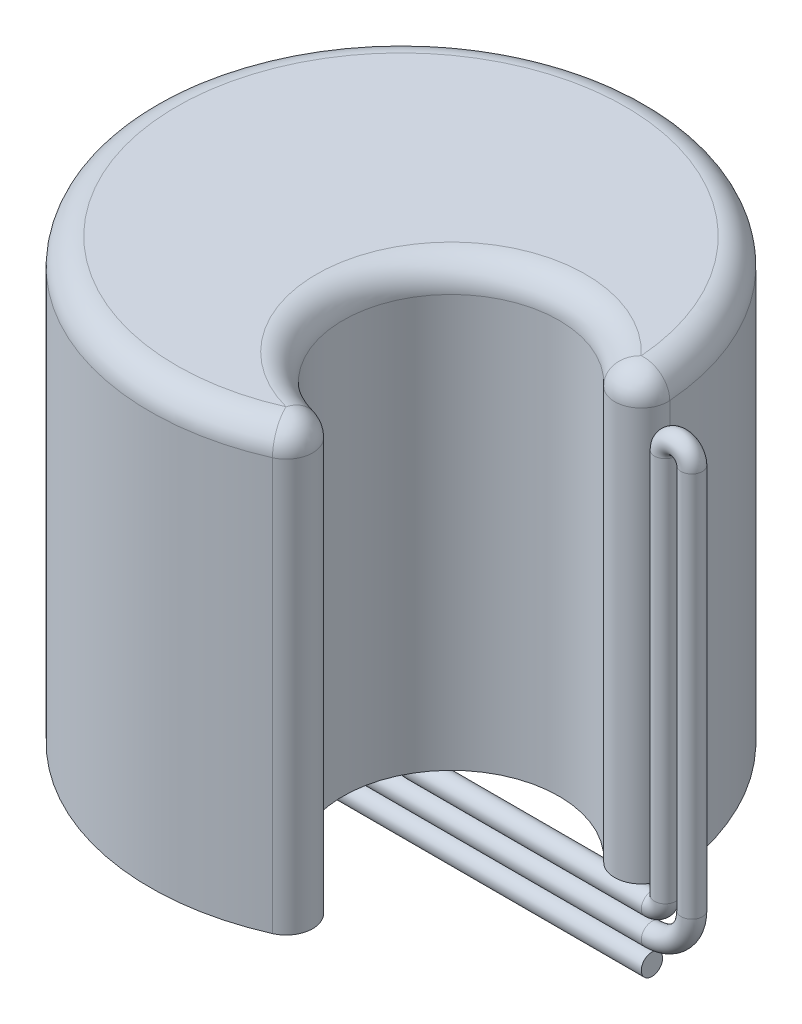
ISO-10303-21;
HEADER;
FILE_DESCRIPTION(('STEP AP214'),'2;1');
FILE_NAME('part.step','',(''),(''),'','','');
FILE_SCHEMA(('AUTOMOTIVE_DESIGN { 1 0 10303 214 1 1 1 1 }'));
ENDSEC;
DATA;
#1=APPLICATION_CONTEXT('core data for automotive mechanical design processes');
#2=APPLICATION_PROTOCOL_DEFINITION('international standard','automotive_design',2000,#1);
#3=PRODUCT_CONTEXT('',#1,'mechanical');
#4=PRODUCT('Part','Part','',(#3));
#5=PRODUCT_RELATED_PRODUCT_CATEGORY('part','',(#4));
#6=PRODUCT_DEFINITION_FORMATION('','',#4);
#7=PRODUCT_DEFINITION_CONTEXT('part definition',#1,'design');
#8=PRODUCT_DEFINITION('design','',#6,#7);
#9=PRODUCT_DEFINITION_SHAPE('','',#8);
#10=(LENGTH_UNIT() NAMED_UNIT(*) SI_UNIT(.MILLI.,.METRE.));
#11=(NAMED_UNIT(*) PLANE_ANGLE_UNIT() SI_UNIT($,.RADIAN.));
#12=(NAMED_UNIT(*) SI_UNIT($,.STERADIAN.) SOLID_ANGLE_UNIT());
#13=UNCERTAINTY_MEASURE_WITH_UNIT(LENGTH_MEASURE(1.E-05),#10,'distance_accuracy_value','');
#14=(GEOMETRIC_REPRESENTATION_CONTEXT(3) GLOBAL_UNCERTAINTY_ASSIGNED_CONTEXT((#13)) GLOBAL_UNIT_ASSIGNED_CONTEXT((#10,
#11,#12)) REPRESENTATION_CONTEXT('',''));
#15=CARTESIAN_POINT('',(0.,0.,0.));
#16=DIRECTION('',(0.,0.,1.));
#17=DIRECTION('',(1.,0.,0.));
#18=AXIS2_PLACEMENT_3D('',#15,#16,#17);
#19=CARTESIAN_POINT('',(0.,0.,0.));
#20=DIRECTION('',(0.,-1.,0.));
#21=DIRECTION('',(0.,0.,-1.));
#22=AXIS2_PLACEMENT_3D('',#19,#20,#21);
#23=PLANE('',#22);
#24=CARTESIAN_POINT('',(53.4321233471194,0.,-3.95267923487891));
#25=DIRECTION('',(0.,-1.,0.));
#26=DIRECTION('',(0.,0.,1.));
#27=AXIS2_PLACEMENT_3D('',#24,#25,#26);
#28=CIRCLE('',#27,6.35000000000001);
#29=CARTESIAN_POINT('',(59.7648194475187,0.,-4.42114492197567));
#30=VERTEX_POINT('',#29);
#31=CARTESIAN_POINT('',(48.791025990063,0.,0.381223777686551));
#32=VERTEX_POINT('',#31);
#33=EDGE_CURVE('E90',#30,#32,#28,.T.);
#34=ORIENTED_EDGE('',*,*,#33,.T.);
#35=CARTESIAN_POINT('',(29.9365679770212,0.,17.9877047662337));
#36=DIRECTION('',(0.,1.,0.));
#37=DIRECTION('',(0.,0.,1.));
#38=AXIS2_PLACEMENT_3D('',#35,#36,#37);
#39=CIRCLE('',#38,25.796875);
#40=CARTESIAN_POINT('',(23.2425998383307,0.,42.9009452283619));
#41=VERTEX_POINT('',#40);
#42=EDGE_CURVE('E98',#32,#41,#39,.T.);
#43=ORIENTED_EDGE('',*,*,#42,.T.);
#44=CARTESIAN_POINT('',(21.5948538349607,0.,49.0334351882703));
#45=DIRECTION('',(0.,-1.,0.));
#46=DIRECTION('',(0.,0.,-1.));
#47=AXIS2_PLACEMENT_3D('',#44,#45,#46);
#48=CIRCLE('',#47,6.35);
#49=CARTESIAN_POINT('',(24.1542439191042,0.,54.8448052846579));
#50=VERTEX_POINT('',#49);
#51=EDGE_CURVE('E95',#41,#50,#48,.T.);
#52=ORIENTED_EDGE('',*,*,#51,.T.);
#53=CARTESIAN_POINT('',(0.,0.,0.));
#54=DIRECTION('',(0.,-1.,0.));
#55=DIRECTION('',(0.,0.,-1.));
#56=AXIS2_PLACEMENT_3D('',#53,#54,#55);
#57=CIRCLE('',#56,59.928125);
#58=EDGE_CURVE('E108',#50,#30,#57,.T.);
#59=ORIENTED_EDGE('',*,*,#58,.T.);
#60=EDGE_LOOP('',(#34,#43,#52,#59));
#61=FACE_BOUND('',#60,.T.);
#62=CARTESIAN_POINT('',(0.,0.,0.));
#63=DIRECTION('',(0.,-1.,0.));
#64=DIRECTION('',(0.,0.,-1.));
#65=AXIS2_PLACEMENT_3D('',#62,#63,#64);
#66=CIRCLE('',#65,2.54);
#67=CARTESIAN_POINT('',(-2.54,0.,0.));
#68=VERTEX_POINT('',#67);
#69=EDGE_CURVE('E120',#68,#68,#66,.T.);
#70=ORIENTED_EDGE('',*,*,#69,.F.);
#71=EDGE_LOOP('',(#70));
#72=FACE_BOUND('',#71,.T.);
#73=ADVANCED_FACE('F35',(#61,#72),#23,.T.);
#74=CARTESIAN_POINT('',(0.,0.,0.));
#75=DIRECTION('',(0.,-1.,0.));
#76=DIRECTION('',(0.,0.,-1.));
#77=AXIS2_PLACEMENT_3D('',#74,#75,#76);
#78=CYLINDRICAL_SURFACE('',#77,59.928125);
#79=DIRECTION('',(0.,1.,0.));
#80=VECTOR('',#79,1.);
#81=CARTESIAN_POINT('',(24.1542439191042,0.,54.8448052846579));
#82=LINE('',#81,#80);
#83=CARTESIAN_POINT('',(24.1542439191042,98.425,54.8448052846579));
#84=VERTEX_POINT('',#83);
#85=EDGE_CURVE('E117',#50,#84,#82,.T.);
#86=ORIENTED_EDGE('',*,*,#85,.T.);
#87=CARTESIAN_POINT('',(0.,98.425,0.));
#88=DIRECTION('',(0.,1.,0.));
#89=DIRECTION('',(0.,0.,1.));
#90=AXIS2_PLACEMENT_3D('',#87,#88,#89);
#91=CIRCLE('',#90,59.928125);
#92=CARTESIAN_POINT('',(59.7648194475187,98.425,-4.42114492197567));
#93=VERTEX_POINT('',#92);
#94=EDGE_CURVE('E11',#84,#93,#91,.F.);
#95=ORIENTED_EDGE('',*,*,#94,.T.);
#96=DIRECTION('',(0.,1.,0.));
#97=VECTOR('',#96,1.);
#98=CARTESIAN_POINT('',(59.7648194475187,0.,-4.42114492197567));
#99=LINE('',#98,#97);
#100=EDGE_CURVE('E114',#30,#93,#99,.T.);
#101=ORIENTED_EDGE('',*,*,#100,.F.);
#102=ORIENTED_EDGE('',*,*,#58,.F.);
#103=EDGE_LOOP('',(#86,#95,#101,#102));
#104=FACE_BOUND('',#103,.T.);
#105=ADVANCED_FACE('F178',(#104),#78,.T.);
#106=CARTESIAN_POINT('',(59.928125,104.775,0.));
#107=DIRECTION('',(0.,1.,0.));
#108=DIRECTION('',(0.,0.,1.));
#109=AXIS2_PLACEMENT_3D('',#106,#107,#108);
#110=PLANE('',#109);
#111=CARTESIAN_POINT('',(0.,104.775,0.));
#112=DIRECTION('',(0.,1.,0.));
#113=DIRECTION('',(0.,0.,1.));
#114=AXIS2_PLACEMENT_3D('',#111,#112,#113);
#115=CIRCLE('',#114,53.578125);
#116=CARTESIAN_POINT('',(53.4321233471194,104.775,-3.95267923487891));
#117=VERTEX_POINT('',#116);
#118=CARTESIAN_POINT('',(21.5948538349607,104.775,49.0334351882703));
#119=VERTEX_POINT('',#118);
#120=EDGE_CURVE('E57',#117,#119,#115,.T.);
#121=ORIENTED_EDGE('',*,*,#120,.T.);
#122=CARTESIAN_POINT('',(29.9365679770212,104.775,17.9877047662337));
#123=DIRECTION('',(0.,1.,0.));
#124=DIRECTION('',(0.,0.,1.));
#125=AXIS2_PLACEMENT_3D('',#122,#123,#124);
#126=CIRCLE('',#125,32.146875);
#127=EDGE_CURVE('E158',#119,#117,#126,.F.);
#128=ORIENTED_EDGE('',*,*,#127,.T.);
#129=EDGE_LOOP('',(#121,#128));
#130=FACE_BOUND('',#129,.T.);
#131=ADVANCED_FACE('F175',(#130),#110,.T.);
#132=CARTESIAN_POINT('',(59.928125,-15.875,0.));
#133=DIRECTION('',(1.,0.,0.));
#134=DIRECTION('',(0.,0.,-1.));
#135=AXIS2_PLACEMENT_3D('',#132,#133,#134);
#136=PLANE('',#135);
#137=CARTESIAN_POINT('',(59.928125,-15.875,0.));
#138=DIRECTION('',(1.,0.,0.));
#139=DIRECTION('',(0.,0.,-1.));
#140=AXIS2_PLACEMENT_3D('',#137,#138,#139);
#141=CIRCLE('',#140,2.54);
#142=CARTESIAN_POINT('',(59.928125,-15.875,-2.54));
#143=VERTEX_POINT('',#142);
#144=EDGE_CURVE('E150',#143,#143,#141,.T.);
#145=ORIENTED_EDGE('',*,*,#144,.T.);
#146=EDGE_LOOP('',(#145));
#147=FACE_BOUND('',#146,.T.);
#148=ADVANCED_FACE('F177',(#147),#136,.T.);
#149=CARTESIAN_POINT('',(3.175,0.,0.));
#150=DIRECTION('',(0.,0.,1.));
#151=DIRECTION('',(1.,0.,0.));
#152=AXIS2_PLACEMENT_3D('',#149,#150,#151);
#153=TOROIDAL_SURFACE('',#152,3.175,2.54);
#154=CARTESIAN_POINT('',(3.175,-3.175,0.));
#155=DIRECTION('',(1.,0.,0.));
#156=DIRECTION('',(0.,0.,-1.));
#157=AXIS2_PLACEMENT_3D('',#154,#155,#156);
#158=CIRCLE('',#157,2.54);
#159=CARTESIAN_POINT('',(3.175,-5.715,0.));
#160=VERTEX_POINT('',#159);
#161=EDGE_CURVE('E116',#160,#160,#158,.T.);
#162=CARTESIAN_POINT('',(3.175,0.,0.));
#163=DIRECTION('',(0.,0.,1.));
#164=DIRECTION('',(1.,0.,0.));
#165=AXIS2_PLACEMENT_3D('',#162,#163,#164);
#166=CIRCLE('',#165,5.715);
#167=EDGE_CURVE('',#68,#160,#166,.T.);
#168=ORIENTED_EDGE('',*,*,#69,.T.);
#169=ORIENTED_EDGE('',*,*,#161,.F.);
#170=ORIENTED_EDGE('',*,*,#167,.T.);
#171=ORIENTED_EDGE('',*,*,#167,.F.);
#172=EDGE_LOOP('',(#168,#170,#169,#171));
#173=FACE_BOUND('',#172,.T.);
#174=ADVANCED_FACE('F185',(#173),#153,.T.);
#175=CARTESIAN_POINT('',(3.175,-3.175,0.));
#176=DIRECTION('',(1.,0.,0.));
#177=DIRECTION('',(0.,0.,-1.));
#178=AXIS2_PLACEMENT_3D('',#175,#176,#177);
#179=CYLINDRICAL_SURFACE('',#178,2.54);
#180=CARTESIAN_POINT('',(59.928125,-3.175,0.));
#181=DIRECTION('',(1.,0.,0.));
#182=DIRECTION('',(0.,0.,-1.));
#183=AXIS2_PLACEMENT_3D('',#180,#181,#182);
#184=CIRCLE('',#183,2.54);
#185=CARTESIAN_POINT('',(59.928125,-5.715,0.));
#186=VERTEX_POINT('',#185);
#187=EDGE_CURVE('E126',#186,#186,#184,.T.);
#188=ORIENTED_EDGE('',*,*,#187,.F.);
#189=EDGE_LOOP('',(#188));
#190=FACE_BOUND('',#189,.T.);
#191=ORIENTED_EDGE('',*,*,#161,.T.);
#192=EDGE_LOOP('',(#191));
#193=FACE_BOUND('',#192,.T.);
#194=ADVANCED_FACE('F222',(#190,#193),#179,.T.);
#195=CARTESIAN_POINT('',(59.928125,0.,0.));
#196=DIRECTION('',(0.,0.,1.));
#197=DIRECTION('',(1.,0.,0.));
#198=AXIS2_PLACEMENT_3D('',#195,#196,#197);
#199=TOROIDAL_SURFACE('',#198,3.175,2.54);
#200=CARTESIAN_POINT('',(63.103125,0.,0.));
#201=DIRECTION('',(0.,1.,0.));
#202=DIRECTION('',(0.,0.,-1.));
#203=AXIS2_PLACEMENT_3D('',#200,#201,#202);
#204=CIRCLE('',#203,2.54);
#205=CARTESIAN_POINT('',(65.643125,0.,0.));
#206=VERTEX_POINT('',#205);
#207=EDGE_CURVE('E129',#206,#206,#204,.T.);
#208=CARTESIAN_POINT('',(59.928125,0.,0.));
#209=DIRECTION('',(0.,0.,1.));
#210=DIRECTION('',(1.,0.,0.));
#211=AXIS2_PLACEMENT_3D('',#208,#209,#210);
#212=CIRCLE('',#211,5.715);
#213=EDGE_CURVE('',#186,#206,#212,.T.);
#214=ORIENTED_EDGE('',*,*,#187,.T.);
#215=ORIENTED_EDGE('',*,*,#207,.F.);
#216=ORIENTED_EDGE('',*,*,#213,.T.);
#217=ORIENTED_EDGE('',*,*,#213,.F.);
#218=EDGE_LOOP('',(#214,#216,#215,#217));
#219=FACE_BOUND('',#218,.T.);
#220=ADVANCED_FACE('F226',(#219),#199,.T.);
#221=CARTESIAN_POINT('',(63.103125,0.,0.));
#222=DIRECTION('',(0.,1.,0.));
#223=DIRECTION('',(0.,0.,1.));
#224=AXIS2_PLACEMENT_3D('',#221,#222,#223);
#225=CYLINDRICAL_SURFACE('',#224,2.54);
#226=CARTESIAN_POINT('',(63.103125,92.075,0.));
#227=DIRECTION('',(0.,1.,0.));
#228=DIRECTION('',(0.,0.,-1.));
#229=AXIS2_PLACEMENT_3D('',#226,#227,#228);
#230=CIRCLE('',#229,2.54);
#231=CARTESIAN_POINT('',(60.563125,92.075,0.));
#232=VERTEX_POINT('',#231);
#233=EDGE_CURVE('E132',#232,#232,#230,.T.);
#234=ORIENTED_EDGE('',*,*,#233,.F.);
#235=EDGE_LOOP('',(#234));
#236=FACE_BOUND('',#235,.T.);
#237=ORIENTED_EDGE('',*,*,#207,.T.);
#238=EDGE_LOOP('',(#237));
#239=FACE_BOUND('',#238,.T.);
#240=ADVANCED_FACE('F230',(#236,#239),#225,.T.);
#241=CARTESIAN_POINT('',(66.278125,92.075,0.));
#242=DIRECTION('',(0.,0.,-1.));
#243=DIRECTION('',(-1.,0.,0.));
#244=AXIS2_PLACEMENT_3D('',#241,#242,#243);
#245=TOROIDAL_SURFACE('',#244,3.175,2.54);
#246=CARTESIAN_POINT('',(69.453125,92.075,0.));
#247=DIRECTION('',(0.,-1.,0.));
#248=DIRECTION('',(0.,0.,-1.));
#249=AXIS2_PLACEMENT_3D('',#246,#247,#248);
#250=CIRCLE('',#249,2.54);
#251=CARTESIAN_POINT('',(71.993125,92.075,0.));
#252=VERTEX_POINT('',#251);
#253=EDGE_CURVE('E135',#252,#252,#250,.T.);
#254=CARTESIAN_POINT('',(66.278125,92.075,0.));
#255=DIRECTION('',(0.,0.,-1.));
#256=DIRECTION('',(-1.,0.,0.));
#257=AXIS2_PLACEMENT_3D('',#254,#255,#256);
#258=CIRCLE('',#257,5.715);
#259=EDGE_CURVE('',#232,#252,#258,.T.);
#260=ORIENTED_EDGE('',*,*,#233,.T.);
#261=ORIENTED_EDGE('',*,*,#253,.F.);
#262=ORIENTED_EDGE('',*,*,#259,.T.);
#263=ORIENTED_EDGE('',*,*,#259,.F.);
#264=EDGE_LOOP('',(#260,#262,#261,#263));
#265=FACE_BOUND('',#264,.T.);
#266=ADVANCED_FACE('F234',(#265),#245,.T.);
#267=CARTESIAN_POINT('',(69.453125,92.075,0.));
#268=DIRECTION('',(0.,-1.,0.));
#269=DIRECTION('',(1.,0.,0.));
#270=AXIS2_PLACEMENT_3D('',#267,#268,#269);
#271=CYLINDRICAL_SURFACE('',#270,2.54);
#272=CARTESIAN_POINT('',(69.453125,0.,0.));
#273=DIRECTION('',(0.,-1.,0.));
#274=DIRECTION('',(0.,0.,-1.));
#275=AXIS2_PLACEMENT_3D('',#272,#273,#274);
#276=CIRCLE('',#275,2.54);
#277=CARTESIAN_POINT('',(71.993125,0.,0.));
#278=VERTEX_POINT('',#277);
#279=EDGE_CURVE('E138',#278,#278,#276,.T.);
#280=ORIENTED_EDGE('',*,*,#279,.F.);
#281=EDGE_LOOP('',(#280));
#282=FACE_BOUND('',#281,.T.);
#283=ORIENTED_EDGE('',*,*,#253,.T.);
#284=EDGE_LOOP('',(#283));
#285=FACE_BOUND('',#284,.T.);
#286=ADVANCED_FACE('F238',(#282,#285),#271,.T.);
#287=CARTESIAN_POINT('',(59.928125,0.,0.));
#288=DIRECTION('',(0.,0.,-1.));
#289=DIRECTION('',(-1.,0.,0.));
#290=AXIS2_PLACEMENT_3D('',#287,#288,#289);
#291=TOROIDAL_SURFACE('',#290,9.52500000000001,2.54);
#292=CARTESIAN_POINT('',(59.928125,-9.52500000000001,0.));
#293=DIRECTION('',(-1.,0.,0.));
#294=DIRECTION('',(0.,0.,-1.));
#295=AXIS2_PLACEMENT_3D('',#292,#293,#294);
#296=CIRCLE('',#295,2.54);
#297=CARTESIAN_POINT('',(59.928125,-12.065,0.));
#298=VERTEX_POINT('',#297);
#299=EDGE_CURVE('E141',#298,#298,#296,.T.);
#300=CARTESIAN_POINT('',(59.928125,0.,0.));
#301=DIRECTION('',(0.,0.,-1.));
#302=DIRECTION('',(-1.,0.,0.));
#303=AXIS2_PLACEMENT_3D('',#300,#301,#302);
#304=CIRCLE('',#303,12.065);
#305=EDGE_CURVE('',#278,#298,#304,.T.);
#306=ORIENTED_EDGE('',*,*,#279,.T.);
#307=ORIENTED_EDGE('',*,*,#299,.F.);
#308=ORIENTED_EDGE('',*,*,#305,.T.);
#309=ORIENTED_EDGE('',*,*,#305,.F.);
#310=EDGE_LOOP('',(#306,#308,#307,#309));
#311=FACE_BOUND('',#310,.T.);
#312=ADVANCED_FACE('F242',(#311),#291,.T.);
#313=CARTESIAN_POINT('',(59.928125,-9.52500000000001,0.));
#314=DIRECTION('',(-1.,0.,0.));
#315=DIRECTION('',(0.,-1.,0.));
#316=AXIS2_PLACEMENT_3D('',#313,#314,#315);
#317=CYLINDRICAL_SURFACE('',#316,2.54);
#318=CARTESIAN_POINT('',(-56.753125,-9.52500000000002,0.));
#319=DIRECTION('',(-1.,0.,0.));
#320=DIRECTION('',(0.,0.,-1.));
#321=AXIS2_PLACEMENT_3D('',#318,#319,#320);
#322=CIRCLE('',#321,2.54);
#323=CARTESIAN_POINT('',(-56.753125,-6.98500000000002,0.));
#324=VERTEX_POINT('',#323);
#325=EDGE_CURVE('E144',#324,#324,#322,.T.);
#326=ORIENTED_EDGE('',*,*,#325,.F.);
#327=EDGE_LOOP('',(#326));
#328=FACE_BOUND('',#327,.T.);
#329=ORIENTED_EDGE('',*,*,#299,.T.);
#330=EDGE_LOOP('',(#329));
#331=FACE_BOUND('',#330,.T.);
#332=ADVANCED_FACE('F246',(#328,#331),#317,.T.);
#333=CARTESIAN_POINT('',(-56.753125,-12.7,0.));
#334=DIRECTION('',(0.,0.,1.));
#335=DIRECTION('',(1.,0.,0.));
#336=AXIS2_PLACEMENT_3D('',#333,#334,#335);
#337=TOROIDAL_SURFACE('',#336,3.175,2.54);
#338=CARTESIAN_POINT('',(-56.753125,-15.875,0.));
#339=DIRECTION('',(1.,0.,0.));
#340=DIRECTION('',(0.,0.,-1.));
#341=AXIS2_PLACEMENT_3D('',#338,#339,#340);
#342=CIRCLE('',#341,2.54);
#343=CARTESIAN_POINT('',(-56.753125,-18.415,0.));
#344=VERTEX_POINT('',#343);
#345=EDGE_CURVE('E147',#344,#344,#342,.T.);
#346=CARTESIAN_POINT('',(-56.753125,-12.7,0.));
#347=DIRECTION('',(0.,0.,1.));
#348=DIRECTION('',(1.,0.,0.));
#349=AXIS2_PLACEMENT_3D('',#346,#347,#348);
#350=CIRCLE('',#349,5.715);
#351=EDGE_CURVE('',#324,#344,#350,.T.);
#352=ORIENTED_EDGE('',*,*,#325,.T.);
#353=ORIENTED_EDGE('',*,*,#345,.F.);
#354=ORIENTED_EDGE('',*,*,#351,.T.);
#355=ORIENTED_EDGE('',*,*,#351,.F.);
#356=EDGE_LOOP('',(#352,#354,#353,#355));
#357=FACE_BOUND('',#356,.T.);
#358=ADVANCED_FACE('F190',(#357),#337,.T.);
#359=CARTESIAN_POINT('',(-56.753125,-15.875,0.));
#360=DIRECTION('',(1.,0.,0.));
#361=DIRECTION('',(0.,0.,-1.));
#362=AXIS2_PLACEMENT_3D('',#359,#360,#361);
#363=CYLINDRICAL_SURFACE('',#362,2.54);
#364=ORIENTED_EDGE('',*,*,#144,.F.);
#365=EDGE_LOOP('',(#364));
#366=FACE_BOUND('',#365,.T.);
#367=ORIENTED_EDGE('',*,*,#345,.T.);
#368=EDGE_LOOP('',(#367));
#369=FACE_BOUND('',#368,.T.);
#370=ADVANCED_FACE('F180',(#366,#369),#363,.T.);
#371=CARTESIAN_POINT('',(53.4321233471194,0.,-3.95267923487891));
#372=DIRECTION('',(0.,1.,0.));
#373=DIRECTION('',(0.,0.,1.));
#374=AXIS2_PLACEMENT_3D('',#371,#372,#373);
#375=CYLINDRICAL_SURFACE('',#374,6.35000000000001);
#376=ORIENTED_EDGE('',*,*,#100,.T.);
#377=CARTESIAN_POINT('',(53.4321233471194,98.425,-3.95267923487891));
#378=DIRECTION('',(0.,1.,0.));
#379=DIRECTION('',(0.,0.,1.));
#380=AXIS2_PLACEMENT_3D('',#377,#378,#379);
#381=CIRCLE('',#380,6.35000000000001);
#382=CARTESIAN_POINT('',(48.791025990063,98.425,0.381223777686551));
#383=VERTEX_POINT('',#382);
#384=EDGE_CURVE('E44',#93,#383,#381,.F.);
#385=ORIENTED_EDGE('',*,*,#384,.T.);
#386=DIRECTION('',(0.,1.,0.));
#387=VECTOR('',#386,1.);
#388=CARTESIAN_POINT('',(48.791025990063,0.,0.381223777686551));
#389=LINE('',#388,#387);
#390=EDGE_CURVE('E86',#32,#383,#389,.T.);
#391=ORIENTED_EDGE('',*,*,#390,.F.);
#392=ORIENTED_EDGE('',*,*,#33,.F.);
#393=EDGE_LOOP('',(#376,#385,#391,#392));
#394=FACE_BOUND('',#393,.T.);
#395=ADVANCED_FACE('F88',(#394),#375,.T.);
#396=CARTESIAN_POINT('',(21.5948538349607,0.,49.0334351882703));
#397=DIRECTION('',(0.,1.,0.));
#398=DIRECTION('',(0.,0.,1.));
#399=AXIS2_PLACEMENT_3D('',#396,#397,#398);
#400=CYLINDRICAL_SURFACE('',#399,6.35);
#401=DIRECTION('',(0.,1.,0.));
#402=VECTOR('',#401,1.);
#403=CARTESIAN_POINT('',(23.2425998383307,0.,42.9009452283619));
#404=LINE('',#403,#402);
#405=CARTESIAN_POINT('',(23.2425998383307,98.425,42.9009452283619));
#406=VERTEX_POINT('',#405);
#407=EDGE_CURVE('E94',#41,#406,#404,.T.);
#408=ORIENTED_EDGE('',*,*,#407,.T.);
#409=CARTESIAN_POINT('',(21.5948538349607,98.425,49.0334351882703));
#410=DIRECTION('',(0.,1.,0.));
#411=DIRECTION('',(0.,0.,1.));
#412=AXIS2_PLACEMENT_3D('',#409,#410,#411);
#413=CIRCLE('',#412,6.35);
#414=EDGE_CURVE('E123',#406,#84,#413,.F.);
#415=ORIENTED_EDGE('',*,*,#414,.T.);
#416=ORIENTED_EDGE('',*,*,#85,.F.);
#417=ORIENTED_EDGE('',*,*,#51,.F.);
#418=EDGE_LOOP('',(#408,#415,#416,#417));
#419=FACE_BOUND('',#418,.T.);
#420=ADVANCED_FACE('F210',(#419),#400,.T.);
#421=CARTESIAN_POINT('',(29.9365679770212,0.,17.9877047662337));
#422=DIRECTION('',(0.,1.,0.));
#423=DIRECTION('',(0.,0.,1.));
#424=AXIS2_PLACEMENT_3D('',#421,#422,#423);
#425=CYLINDRICAL_SURFACE('',#424,25.796875);
#426=ORIENTED_EDGE('',*,*,#390,.T.);
#427=CARTESIAN_POINT('',(29.9365679770212,98.425,17.9877047662337));
#428=DIRECTION('',(0.,1.,0.));
#429=DIRECTION('',(0.,0.,1.));
#430=AXIS2_PLACEMENT_3D('',#427,#428,#429);
#431=CIRCLE('',#430,25.796875);
#432=EDGE_CURVE('E155',#383,#406,#431,.T.);
#433=ORIENTED_EDGE('',*,*,#432,.T.);
#434=ORIENTED_EDGE('',*,*,#407,.F.);
#435=ORIENTED_EDGE('',*,*,#42,.F.);
#436=EDGE_LOOP('',(#426,#433,#434,#435));
#437=FACE_BOUND('',#436,.T.);
#438=ADVANCED_FACE('F99',(#437),#425,.F.);
#439=CARTESIAN_POINT('',(53.4321233471194,98.425,-3.95267923487891));
#440=DIRECTION('',(0.,1.,0.));
#441=DIRECTION('',(0.,0.,1.));
#442=AXIS2_PLACEMENT_3D('',#439,#440,#441);
#443=SPHERICAL_SURFACE('',#442,6.35);
#444=CARTESIAN_POINT('',(53.4321233471194,98.425,-3.95267923487891));
#445=DIRECTION('',(-0.0737741239522466,0.,-0.99727497644084));
#446=DIRECTION('',(-0.99727497644084,0.,0.0737741239522466));
#447=AXIS2_PLACEMENT_3D('',#444,#445,#446);
#448=CIRCLE('',#447,6.35);
#449=EDGE_CURVE('E111',#117,#93,#448,.T.);
#450=ORIENTED_EDGE('',*,*,#449,.F.);
#451=CARTESIAN_POINT('',(53.4321233471194,98.425,-3.9526792348789));
#452=DIRECTION('',(-0.68250441142763,0.,-0.730881473552192));
#453=DIRECTION('',(-0.730881473552192,0.,0.68250441142763));
#454=AXIS2_PLACEMENT_3D('',#451,#452,#453);
#455=CIRCLE('',#454,6.35);
#456=EDGE_CURVE('E39',#383,#117,#455,.T.);
#457=ORIENTED_EDGE('',*,*,#456,.F.);
#458=ORIENTED_EDGE('',*,*,#384,.F.);
#459=EDGE_LOOP('',(#450,#457,#458));
#460=FACE_BOUND('',#459,.T.);
#461=ADVANCED_FACE('F37',(#460),#443,.T.);
#462=CARTESIAN_POINT('',(29.9365679770212,98.425,17.9877047662337));
#463=DIRECTION('',(0.,1.,0.));
#464=DIRECTION('',(0.,0.,1.));
#465=AXIS2_PLACEMENT_3D('',#462,#463,#464);
#466=TOROIDAL_SURFACE('',#465,32.146875,6.35);
#467=ORIENTED_EDGE('',*,*,#456,.T.);
#468=ORIENTED_EDGE('',*,*,#127,.F.);
#469=CARTESIAN_POINT('',(21.5948538349607,98.425,49.0334351882703));
#470=DIRECTION('',(0.965746450379287,0.,0.259487559585824));
#471=DIRECTION('',(0.259487559585824,0.,-0.965746450379288));
#472=AXIS2_PLACEMENT_3D('',#469,#470,#471);
#473=CIRCLE('',#472,6.35);
#474=EDGE_CURVE('E163',#406,#119,#473,.T.);
#475=ORIENTED_EDGE('',*,*,#474,.F.);
#476=ORIENTED_EDGE('',*,*,#432,.F.);
#477=EDGE_LOOP('',(#467,#468,#475,#476));
#478=FACE_BOUND('',#477,.T.);
#479=ADVANCED_FACE('F173',(#478),#466,.T.);
#480=CARTESIAN_POINT('',(0.,98.425,0.));
#481=DIRECTION('',(0.,1.,0.));
#482=DIRECTION('',(0.,0.,1.));
#483=AXIS2_PLACEMENT_3D('',#480,#481,#482);
#484=TOROIDAL_SURFACE('',#483,53.578125,6.35);
#485=ORIENTED_EDGE('',*,*,#449,.T.);
#486=ORIENTED_EDGE('',*,*,#94,.F.);
#487=CARTESIAN_POINT('',(21.5948538349607,98.425,49.0334351882703));
#488=DIRECTION('',(0.915176393131905,0.,-0.40305355655803));
#489=DIRECTION('',(-0.40305355655803,0.,-0.915176393131905));
#490=AXIS2_PLACEMENT_3D('',#487,#488,#489);
#491=CIRCLE('',#490,6.35);
#492=EDGE_CURVE('E161',#119,#84,#491,.T.);
#493=ORIENTED_EDGE('',*,*,#492,.F.);
#494=ORIENTED_EDGE('',*,*,#120,.F.);
#495=EDGE_LOOP('',(#485,#486,#493,#494));
#496=FACE_BOUND('',#495,.T.);
#497=ADVANCED_FACE('F168',(#496),#484,.T.);
#498=CARTESIAN_POINT('',(21.5948538349607,98.425,49.0334351882703));
#499=DIRECTION('',(0.,1.,0.));
#500=DIRECTION('',(0.,0.,1.));
#501=AXIS2_PLACEMENT_3D('',#498,#499,#500);
#502=SPHERICAL_SURFACE('',#501,6.35);
#503=ORIENTED_EDGE('',*,*,#414,.F.);
#504=ORIENTED_EDGE('',*,*,#474,.T.);
#505=ORIENTED_EDGE('',*,*,#492,.T.);
#506=EDGE_LOOP('',(#503,#504,#505));
#507=FACE_BOUND('',#506,.T.);
#508=ADVANCED_FACE('F198',(#507),#502,.T.);
#509=CLOSED_SHELL('',(#73,#105,#131,#148,#174,#194,#220,#240,#266,#286,#312,#332,#358,#370,#395,
#420,#438,#461,#479,#497,#508));
#510=MANIFOLD_SOLID_BREP('B2',#509);
#511=ADVANCED_BREP_SHAPE_REPRESENTATION('',(#18,#510),#14);
#512=SHAPE_DEFINITION_REPRESENTATION(#9,#511);
ENDSEC;
END-ISO-10303-21;
